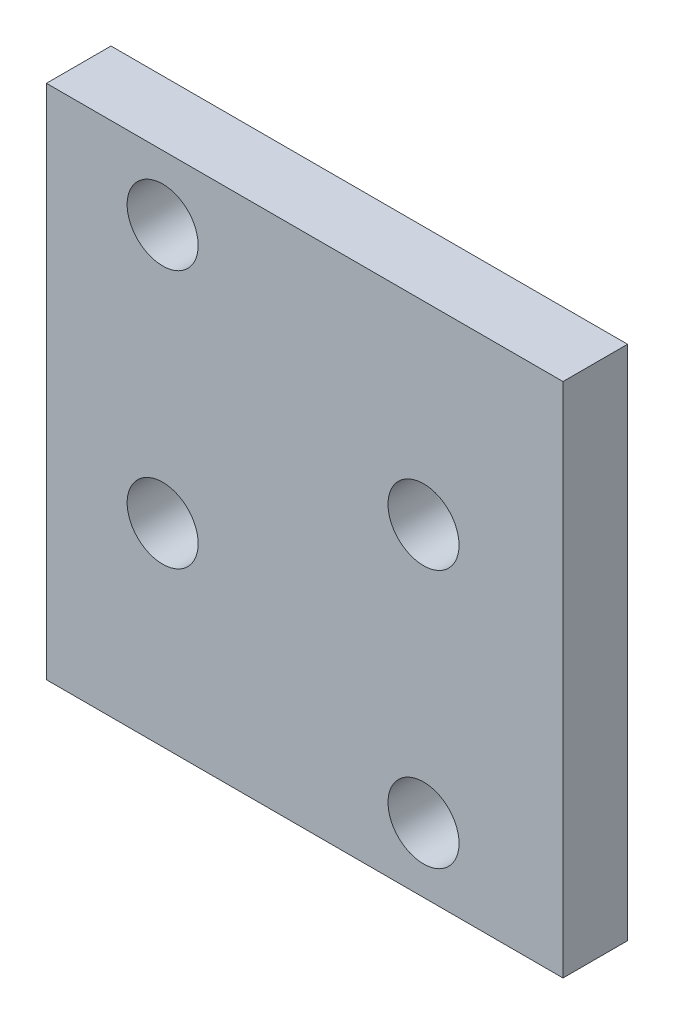
ISO-10303-21;
HEADER;
FILE_DESCRIPTION(('STEP AP214'),'2;1');
FILE_NAME('part.step','',(''),(''),'','','');
FILE_SCHEMA(('AUTOMOTIVE_DESIGN { 1 0 10303 214 1 1 1 1 }'));
ENDSEC;
DATA;
#1=APPLICATION_CONTEXT('core data for automotive mechanical design processes');
#2=APPLICATION_PROTOCOL_DEFINITION('international standard','automotive_design',2000,#1);
#3=PRODUCT_CONTEXT('',#1,'mechanical');
#4=PRODUCT('Part','Part','',(#3));
#5=PRODUCT_RELATED_PRODUCT_CATEGORY('part','',(#4));
#6=PRODUCT_DEFINITION_FORMATION('','',#4);
#7=PRODUCT_DEFINITION_CONTEXT('part definition',#1,'design');
#8=PRODUCT_DEFINITION('design','',#6,#7);
#9=PRODUCT_DEFINITION_SHAPE('','',#8);
#10=(LENGTH_UNIT() NAMED_UNIT(*) SI_UNIT(.MILLI.,.METRE.));
#11=(NAMED_UNIT(*) PLANE_ANGLE_UNIT() SI_UNIT($,.RADIAN.));
#12=(NAMED_UNIT(*) SI_UNIT($,.STERADIAN.) SOLID_ANGLE_UNIT());
#13=UNCERTAINTY_MEASURE_WITH_UNIT(LENGTH_MEASURE(1.E-05),#10,'distance_accuracy_value','');
#14=(GEOMETRIC_REPRESENTATION_CONTEXT(3) GLOBAL_UNCERTAINTY_ASSIGNED_CONTEXT((#13)) GLOBAL_UNIT_ASSIGNED_CONTEXT((#10,
#11,#12)) REPRESENTATION_CONTEXT('',''));
#15=CARTESIAN_POINT('',(0.,0.,0.));
#16=DIRECTION('',(0.,0.,1.));
#17=DIRECTION('',(1.,0.,0.));
#18=AXIS2_PLACEMENT_3D('',#15,#16,#17);
#19=CARTESIAN_POINT('',(0.,0.,5.));
#20=DIRECTION('',(1.,0.,0.));
#21=DIRECTION('',(0.,0.,-1.));
#22=AXIS2_PLACEMENT_3D('',#19,#20,#21);
#23=PLANE('',#22);
#24=DIRECTION('',(0.,-1.,0.));
#25=VECTOR('',#24,1.);
#26=CARTESIAN_POINT('',(0.,0.,0.));
#27=LINE('',#26,#25);
#28=CARTESIAN_POINT('',(0.,40.,0.));
#29=VERTEX_POINT('',#28);
#30=CARTESIAN_POINT('',(0.,0.,0.));
#31=VERTEX_POINT('',#30);
#32=EDGE_CURVE('E97',#29,#31,#27,.T.);
#33=ORIENTED_EDGE('',*,*,#32,.T.);
#34=DIRECTION('',(0.,0.,-1.));
#35=VECTOR('',#34,1.);
#36=CARTESIAN_POINT('',(0.,0.,5.));
#37=LINE('',#36,#35);
#38=CARTESIAN_POINT('',(0.,0.,5.));
#39=VERTEX_POINT('',#38);
#40=EDGE_CURVE('E11',#39,#31,#37,.T.);
#41=ORIENTED_EDGE('',*,*,#40,.F.);
#42=DIRECTION('',(0.,-1.,0.));
#43=VECTOR('',#42,1.);
#44=CARTESIAN_POINT('',(0.,0.,5.));
#45=LINE('',#44,#43);
#46=CARTESIAN_POINT('',(0.,40.,5.));
#47=VERTEX_POINT('',#46);
#48=EDGE_CURVE('E85',#47,#39,#45,.T.);
#49=ORIENTED_EDGE('',*,*,#48,.F.);
#50=DIRECTION('',(0.,0.,-1.));
#51=VECTOR('',#50,1.);
#52=CARTESIAN_POINT('',(0.,40.,5.));
#53=LINE('',#52,#51);
#54=EDGE_CURVE('E93',#47,#29,#53,.T.);
#55=ORIENTED_EDGE('',*,*,#54,.T.);
#56=EDGE_LOOP('',(#33,#41,#49,#55));
#57=FACE_BOUND('',#56,.T.);
#58=ADVANCED_FACE('F34',(#57),#23,.F.);
#59=CARTESIAN_POINT('',(0.,0.,5.));
#60=DIRECTION('',(0.,1.,0.));
#61=DIRECTION('',(0.,0.,1.));
#62=AXIS2_PLACEMENT_3D('',#59,#60,#61);
#63=PLANE('',#62);
#64=DIRECTION('',(1.,0.,0.));
#65=VECTOR('',#64,1.);
#66=CARTESIAN_POINT('',(0.,0.,0.));
#67=LINE('',#66,#65);
#68=CARTESIAN_POINT('',(40.,0.,0.));
#69=VERTEX_POINT('',#68);
#70=EDGE_CURVE('E89',#31,#69,#67,.T.);
#71=ORIENTED_EDGE('',*,*,#70,.T.);
#72=DIRECTION('',(0.,0.,-1.));
#73=VECTOR('',#72,1.);
#74=CARTESIAN_POINT('',(40.,0.,5.));
#75=LINE('',#74,#73);
#76=CARTESIAN_POINT('',(40.,0.,5.));
#77=VERTEX_POINT('',#76);
#78=EDGE_CURVE('E42',#77,#69,#75,.T.);
#79=ORIENTED_EDGE('',*,*,#78,.F.);
#80=DIRECTION('',(1.,0.,0.));
#81=VECTOR('',#80,1.);
#82=CARTESIAN_POINT('',(0.,0.,5.));
#83=LINE('',#82,#81);
#84=EDGE_CURVE('E80',#39,#77,#83,.T.);
#85=ORIENTED_EDGE('',*,*,#84,.F.);
#86=ORIENTED_EDGE('',*,*,#40,.T.);
#87=EDGE_LOOP('',(#71,#79,#85,#86));
#88=FACE_BOUND('',#87,.T.);
#89=ADVANCED_FACE('F88',(#88),#63,.F.);
#90=CARTESIAN_POINT('',(40.,0.,5.));
#91=DIRECTION('',(-1.,0.,0.));
#92=DIRECTION('',(0.,0.,1.));
#93=AXIS2_PLACEMENT_3D('',#90,#91,#92);
#94=PLANE('',#93);
#95=DIRECTION('',(0.,1.,0.));
#96=VECTOR('',#95,1.);
#97=CARTESIAN_POINT('',(40.,0.,0.));
#98=LINE('',#97,#96);
#99=CARTESIAN_POINT('',(40.,40.,0.));
#100=VERTEX_POINT('',#99);
#101=EDGE_CURVE('E67',#69,#100,#98,.T.);
#102=ORIENTED_EDGE('',*,*,#101,.T.);
#103=DIRECTION('',(0.,0.,-1.));
#104=VECTOR('',#103,1.);
#105=CARTESIAN_POINT('',(40.,40.,5.));
#106=LINE('',#105,#104);
#107=CARTESIAN_POINT('',(40.,40.,5.));
#108=VERTEX_POINT('',#107);
#109=EDGE_CURVE('E90',#108,#100,#106,.T.);
#110=ORIENTED_EDGE('',*,*,#109,.F.);
#111=DIRECTION('',(0.,1.,0.));
#112=VECTOR('',#111,1.);
#113=CARTESIAN_POINT('',(40.,0.,5.));
#114=LINE('',#113,#112);
#115=EDGE_CURVE('E83',#77,#108,#114,.T.);
#116=ORIENTED_EDGE('',*,*,#115,.F.);
#117=ORIENTED_EDGE('',*,*,#78,.T.);
#118=EDGE_LOOP('',(#102,#110,#116,#117));
#119=FACE_BOUND('',#118,.T.);
#120=ADVANCED_FACE('F91',(#119),#94,.F.);
#121=CARTESIAN_POINT('',(0.,40.,5.));
#122=DIRECTION('',(0.,-1.,0.));
#123=DIRECTION('',(0.,0.,-1.));
#124=AXIS2_PLACEMENT_3D('',#121,#122,#123);
#125=PLANE('',#124);
#126=DIRECTION('',(-1.,0.,0.));
#127=VECTOR('',#126,1.);
#128=CARTESIAN_POINT('',(0.,40.,0.));
#129=LINE('',#128,#127);
#130=EDGE_CURVE('E73',#100,#29,#129,.T.);
#131=ORIENTED_EDGE('',*,*,#130,.T.);
#132=ORIENTED_EDGE('',*,*,#54,.F.);
#133=DIRECTION('',(-1.,0.,0.));
#134=VECTOR('',#133,1.);
#135=CARTESIAN_POINT('',(0.,40.,5.));
#136=LINE('',#135,#134);
#137=EDGE_CURVE('E50',#108,#47,#136,.T.);
#138=ORIENTED_EDGE('',*,*,#137,.F.);
#139=ORIENTED_EDGE('',*,*,#109,.T.);
#140=EDGE_LOOP('',(#131,#132,#138,#139));
#141=FACE_BOUND('',#140,.T.);
#142=ADVANCED_FACE('F105',(#141),#125,.F.);
#143=CARTESIAN_POINT('',(0.,0.,5.));
#144=DIRECTION('',(0.,0.,-1.));
#145=DIRECTION('',(-1.,0.,0.));
#146=AXIS2_PLACEMENT_3D('',#143,#144,#145);
#147=PLANE('',#146);
#148=CARTESIAN_POINT('',(29.2,25.,5.));
#149=DIRECTION('',(0.,0.,1.));
#150=DIRECTION('',(1.,0.,0.));
#151=AXIS2_PLACEMENT_3D('',#148,#149,#150);
#152=CIRCLE('',#151,2.75);
#153=CARTESIAN_POINT('',(31.95,25.,5.));
#154=VERTEX_POINT('',#153);
#155=EDGE_CURVE('E129',#154,#154,#152,.T.);
#156=ORIENTED_EDGE('',*,*,#155,.F.);
#157=EDGE_LOOP('',(#156));
#158=FACE_BOUND('',#157,.T.);
#159=CARTESIAN_POINT('',(29.2,5.,5.));
#160=DIRECTION('',(0.,0.,1.));
#161=DIRECTION('',(1.,0.,0.));
#162=AXIS2_PLACEMENT_3D('',#159,#160,#161);
#163=CIRCLE('',#162,2.75);
#164=CARTESIAN_POINT('',(31.95,5.,5.));
#165=VERTEX_POINT('',#164);
#166=EDGE_CURVE('E123',#165,#165,#163,.T.);
#167=ORIENTED_EDGE('',*,*,#166,.F.);
#168=EDGE_LOOP('',(#167));
#169=FACE_BOUND('',#168,.T.);
#170=CARTESIAN_POINT('',(9.,15.,5.));
#171=DIRECTION('',(0.,0.,1.));
#172=DIRECTION('',(1.,0.,0.));
#173=AXIS2_PLACEMENT_3D('',#170,#171,#172);
#174=CIRCLE('',#173,2.75);
#175=CARTESIAN_POINT('',(11.75,15.,5.));
#176=VERTEX_POINT('',#175);
#177=EDGE_CURVE('E117',#176,#176,#174,.T.);
#178=ORIENTED_EDGE('',*,*,#177,.F.);
#179=EDGE_LOOP('',(#178));
#180=FACE_BOUND('',#179,.T.);
#181=CARTESIAN_POINT('',(8.99999999999999,35.,5.));
#182=DIRECTION('',(0.,0.,1.));
#183=DIRECTION('',(1.,0.,0.));
#184=AXIS2_PLACEMENT_3D('',#181,#182,#183);
#185=CIRCLE('',#184,2.75);
#186=CARTESIAN_POINT('',(11.75,35.,5.));
#187=VERTEX_POINT('',#186);
#188=EDGE_CURVE('E111',#187,#187,#185,.T.);
#189=ORIENTED_EDGE('',*,*,#188,.F.);
#190=EDGE_LOOP('',(#189));
#191=FACE_BOUND('',#190,.T.);
#192=ORIENTED_EDGE('',*,*,#48,.T.);
#193=ORIENTED_EDGE('',*,*,#84,.T.);
#194=ORIENTED_EDGE('',*,*,#115,.T.);
#195=ORIENTED_EDGE('',*,*,#137,.T.);
#196=EDGE_LOOP('',(#192,#193,#194,#195));
#197=FACE_BOUND('',#196,.T.);
#198=ADVANCED_FACE('F81',(#158,#169,#180,#191,#197),#147,.F.);
#199=CARTESIAN_POINT('',(0.,0.,0.));
#200=DIRECTION('',(0.,0.,-1.));
#201=DIRECTION('',(-1.,0.,0.));
#202=AXIS2_PLACEMENT_3D('',#199,#200,#201);
#203=PLANE('',#202);
#204=CARTESIAN_POINT('',(29.2,25.,0.));
#205=DIRECTION('',(0.,0.,1.));
#206=DIRECTION('',(1.,0.,0.));
#207=AXIS2_PLACEMENT_3D('',#204,#205,#206);
#208=CIRCLE('',#207,2.75);
#209=CARTESIAN_POINT('',(31.95,25.,0.));
#210=VERTEX_POINT('',#209);
#211=EDGE_CURVE('E126',#210,#210,#208,.T.);
#212=ORIENTED_EDGE('',*,*,#211,.T.);
#213=EDGE_LOOP('',(#212));
#214=FACE_BOUND('',#213,.T.);
#215=CARTESIAN_POINT('',(29.2,5.,0.));
#216=DIRECTION('',(0.,0.,1.));
#217=DIRECTION('',(1.,0.,0.));
#218=AXIS2_PLACEMENT_3D('',#215,#216,#217);
#219=CIRCLE('',#218,2.75);
#220=CARTESIAN_POINT('',(31.95,5.,0.));
#221=VERTEX_POINT('',#220);
#222=EDGE_CURVE('E120',#221,#221,#219,.T.);
#223=ORIENTED_EDGE('',*,*,#222,.T.);
#224=EDGE_LOOP('',(#223));
#225=FACE_BOUND('',#224,.T.);
#226=CARTESIAN_POINT('',(9.,15.,0.));
#227=DIRECTION('',(0.,0.,1.));
#228=DIRECTION('',(1.,0.,0.));
#229=AXIS2_PLACEMENT_3D('',#226,#227,#228);
#230=CIRCLE('',#229,2.75);
#231=CARTESIAN_POINT('',(11.75,15.,0.));
#232=VERTEX_POINT('',#231);
#233=EDGE_CURVE('E114',#232,#232,#230,.T.);
#234=ORIENTED_EDGE('',*,*,#233,.T.);
#235=EDGE_LOOP('',(#234));
#236=FACE_BOUND('',#235,.T.);
#237=CARTESIAN_POINT('',(8.99999999999999,35.,0.));
#238=DIRECTION('',(0.,0.,1.));
#239=DIRECTION('',(1.,0.,0.));
#240=AXIS2_PLACEMENT_3D('',#237,#238,#239);
#241=CIRCLE('',#240,2.75);
#242=CARTESIAN_POINT('',(11.75,35.,0.));
#243=VERTEX_POINT('',#242);
#244=EDGE_CURVE('E100',#243,#243,#241,.T.);
#245=ORIENTED_EDGE('',*,*,#244,.T.);
#246=EDGE_LOOP('',(#245));
#247=FACE_BOUND('',#246,.T.);
#248=ORIENTED_EDGE('',*,*,#32,.F.);
#249=ORIENTED_EDGE('',*,*,#130,.F.);
#250=ORIENTED_EDGE('',*,*,#101,.F.);
#251=ORIENTED_EDGE('',*,*,#70,.F.);
#252=EDGE_LOOP('',(#248,#249,#250,#251));
#253=FACE_BOUND('',#252,.T.);
#254=ADVANCED_FACE('F108',(#214,#225,#236,#247,#253),#203,.T.);
#255=CARTESIAN_POINT('',(8.99999999999999,35.,0.));
#256=DIRECTION('',(0.,0.,1.));
#257=DIRECTION('',(1.,0.,0.));
#258=AXIS2_PLACEMENT_3D('',#255,#256,#257);
#259=CYLINDRICAL_SURFACE('',#258,2.75);
#260=ORIENTED_EDGE('',*,*,#244,.F.);
#261=EDGE_LOOP('',(#260));
#262=FACE_BOUND('',#261,.T.);
#263=ORIENTED_EDGE('',*,*,#188,.T.);
#264=EDGE_LOOP('',(#263));
#265=FACE_BOUND('',#264,.T.);
#266=ADVANCED_FACE('F153',(#262,#265),#259,.F.);
#267=CARTESIAN_POINT('',(9.,15.,0.));
#268=DIRECTION('',(0.,0.,1.));
#269=DIRECTION('',(1.,0.,0.));
#270=AXIS2_PLACEMENT_3D('',#267,#268,#269);
#271=CYLINDRICAL_SURFACE('',#270,2.75);
#272=ORIENTED_EDGE('',*,*,#233,.F.);
#273=EDGE_LOOP('',(#272));
#274=FACE_BOUND('',#273,.T.);
#275=ORIENTED_EDGE('',*,*,#177,.T.);
#276=EDGE_LOOP('',(#275));
#277=FACE_BOUND('',#276,.T.);
#278=ADVANCED_FACE('F155',(#274,#277),#271,.F.);
#279=CARTESIAN_POINT('',(29.2,5.,0.));
#280=DIRECTION('',(0.,0.,1.));
#281=DIRECTION('',(1.,0.,0.));
#282=AXIS2_PLACEMENT_3D('',#279,#280,#281);
#283=CYLINDRICAL_SURFACE('',#282,2.75);
#284=ORIENTED_EDGE('',*,*,#222,.F.);
#285=EDGE_LOOP('',(#284));
#286=FACE_BOUND('',#285,.T.);
#287=ORIENTED_EDGE('',*,*,#166,.T.);
#288=EDGE_LOOP('',(#287));
#289=FACE_BOUND('',#288,.T.);
#290=ADVANCED_FACE('F140',(#286,#289),#283,.F.);
#291=CARTESIAN_POINT('',(29.2,25.,0.));
#292=DIRECTION('',(0.,0.,1.));
#293=DIRECTION('',(1.,0.,0.));
#294=AXIS2_PLACEMENT_3D('',#291,#292,#293);
#295=CYLINDRICAL_SURFACE('',#294,2.75);
#296=ORIENTED_EDGE('',*,*,#211,.F.);
#297=EDGE_LOOP('',(#296));
#298=FACE_BOUND('',#297,.T.);
#299=ORIENTED_EDGE('',*,*,#155,.T.);
#300=EDGE_LOOP('',(#299));
#301=FACE_BOUND('',#300,.T.);
#302=ADVANCED_FACE('F137',(#298,#301),#295,.F.);
#303=CLOSED_SHELL('',(#58,#89,#120,#142,#198,#254,#266,#278,#290,#302));
#304=MANIFOLD_SOLID_BREP('B2',#303);
#305=ADVANCED_BREP_SHAPE_REPRESENTATION('',(#18,#304),#14);
#306=SHAPE_DEFINITION_REPRESENTATION(#9,#305);
ENDSEC;
END-ISO-10303-21;
